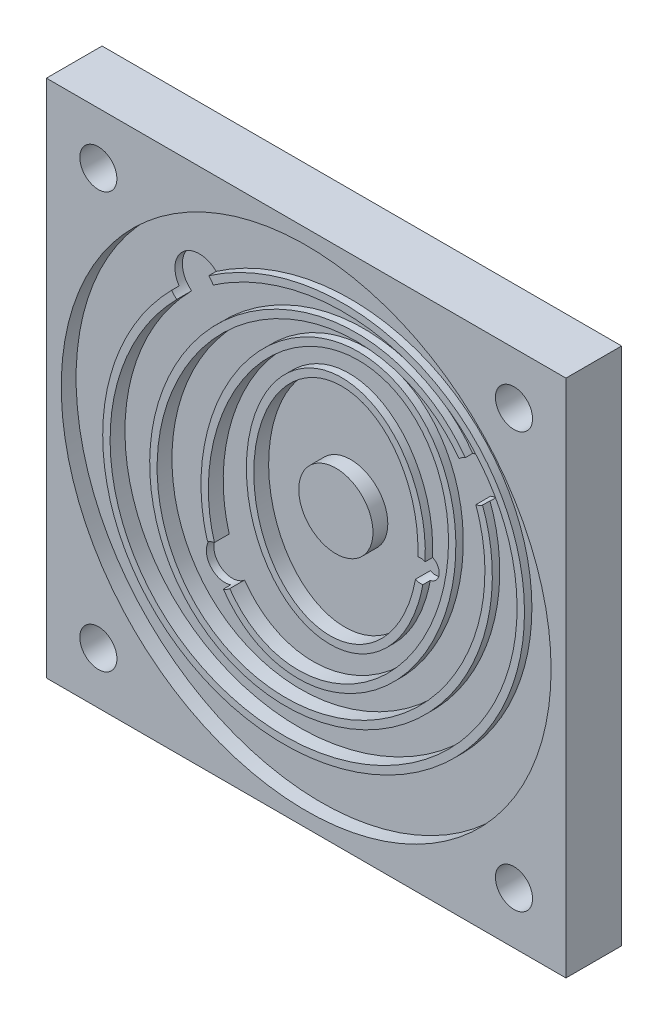
ISO-10303-21;
HEADER;
FILE_DESCRIPTION(('STEP AP214'),'2;1');
FILE_NAME('part.step','',(''),(''),'','','');
FILE_SCHEMA(('AUTOMOTIVE_DESIGN { 1 0 10303 214 1 1 1 1 }'));
ENDSEC;
DATA;
#1=APPLICATION_CONTEXT('core data for automotive mechanical design processes');
#2=APPLICATION_PROTOCOL_DEFINITION('international standard','automotive_design',2000,#1);
#3=PRODUCT_CONTEXT('',#1,'mechanical');
#4=PRODUCT('Part','Part','',(#3));
#5=PRODUCT_RELATED_PRODUCT_CATEGORY('part','',(#4));
#6=PRODUCT_DEFINITION_FORMATION('','',#4);
#7=PRODUCT_DEFINITION_CONTEXT('part definition',#1,'design');
#8=PRODUCT_DEFINITION('design','',#6,#7);
#9=PRODUCT_DEFINITION_SHAPE('','',#8);
#10=(LENGTH_UNIT() NAMED_UNIT(*) SI_UNIT(.MILLI.,.METRE.));
#11=(NAMED_UNIT(*) PLANE_ANGLE_UNIT() SI_UNIT($,.RADIAN.));
#12=(NAMED_UNIT(*) SI_UNIT($,.STERADIAN.) SOLID_ANGLE_UNIT());
#13=UNCERTAINTY_MEASURE_WITH_UNIT(LENGTH_MEASURE(1.E-05),#10,'distance_accuracy_value','');
#14=(GEOMETRIC_REPRESENTATION_CONTEXT(3) GLOBAL_UNCERTAINTY_ASSIGNED_CONTEXT((#13)) GLOBAL_UNIT_ASSIGNED_CONTEXT((#10,
#11,#12)) REPRESENTATION_CONTEXT('',''));
#15=CARTESIAN_POINT('',(0.,0.,0.));
#16=DIRECTION('',(0.,0.,1.));
#17=DIRECTION('',(1.,0.,0.));
#18=AXIS2_PLACEMENT_3D('',#15,#16,#17);
#19=CARTESIAN_POINT('',(0.,0.,2.54));
#20=DIRECTION('',(0.,0.,1.));
#21=DIRECTION('',(-0.11130266352812,-0.993786555096992,0.));
#22=AXIS2_PLACEMENT_3D('',#19,#20,#21);
#23=ELLIPSE('',#22,20.32,15.24);
#24=DIRECTION('',(0.,0.,1.));
#25=VECTOR('',#24,1.);
#26=SURFACE_OF_LINEAR_EXTRUSION('',#23,#25);
#27=DIRECTION('',(0.,0.,1.));
#28=VECTOR('',#27,1.);
#29=CARTESIAN_POINT('',(14.8837053667459,-3.48793318147961,2.54));
#30=LINE('',#29,#28);
#31=CARTESIAN_POINT('',(14.8837053667459,-3.48793318147961,2.54));
#32=VERTEX_POINT('',#31);
#33=CARTESIAN_POINT('',(14.8837053667459,-3.48793318147961,3.81));
#34=VERTEX_POINT('',#33);
#35=EDGE_CURVE('E201',#32,#34,#30,.T.);
#36=ORIENTED_EDGE('',*,*,#35,.T.);
#37=CARTESIAN_POINT('',(0.,0.,3.81));
#38=DIRECTION('',(0.,0.,1.));
#39=DIRECTION('',(-0.11130266352812,-0.993786555096992,0.));
#40=AXIS2_PLACEMENT_3D('',#37,#38,#39);
#41=ELLIPSE('',#40,20.32,15.24);
#42=CARTESIAN_POINT('',(15.2865464471401,0.108908411042989,3.81));
#43=VERTEX_POINT('',#42);
#44=EDGE_CURVE('E189',#34,#43,#41,.F.);
#45=ORIENTED_EDGE('',*,*,#44,.T.);
#46=DIRECTION('',(0.,0.,1.));
#47=VECTOR('',#46,1.);
#48=CARTESIAN_POINT('',(15.2865464471401,0.108908411042989,2.54));
#49=LINE('',#48,#47);
#50=CARTESIAN_POINT('',(15.2865464471401,0.108908411042988,2.54));
#51=VERTEX_POINT('',#50);
#52=EDGE_CURVE('E200',#51,#43,#49,.T.);
#53=ORIENTED_EDGE('',*,*,#52,.F.);
#54=EDGE_CURVE('E229',#51,#32,#23,.T.);
#55=ORIENTED_EDGE('',*,*,#54,.T.);
#56=EDGE_LOOP('',(#36,#45,#53,#55));
#57=FACE_BOUND('',#56,.T.);
#58=ADVANCED_FACE('F53',(#57),#26,.T.);
#59=CARTESIAN_POINT('',(0.,0.,1.27));
#60=DIRECTION('',(0.,0.,1.));
#61=DIRECTION('',(-0.11130266352812,-0.993786555096992,0.));
#62=AXIS2_PLACEMENT_3D('',#59,#60,#61);
#63=ELLIPSE('',#62,19.05,13.97);
#64=DIRECTION('',(0.,0.,1.));
#65=VECTOR('',#64,1.);
#66=SURFACE_OF_LINEAR_EXTRUSION('',#63,#65);
#67=CARTESIAN_POINT('',(0.,0.,3.81));
#68=DIRECTION('',(0.,0.,1.));
#69=DIRECTION('',(-0.11130266352812,-0.993786555096992,0.));
#70=AXIS2_PLACEMENT_3D('',#67,#68,#69);
#71=ELLIPSE('',#70,19.05,13.97);
#72=CARTESIAN_POINT('',(13.6267115839412,-3.30400999929288,3.81));
#73=VERTEX_POINT('',#72);
#74=CARTESIAN_POINT('',(14.0200087660044,0.207617119973123,3.81));
#75=VERTEX_POINT('',#74);
#76=EDGE_CURVE('E67',#73,#75,#71,.F.);
#77=ORIENTED_EDGE('',*,*,#76,.F.);
#78=DIRECTION('',(0.,0.,1.));
#79=VECTOR('',#78,1.);
#80=CARTESIAN_POINT('',(13.6267115839412,-3.30400999929288,1.27));
#81=LINE('',#80,#79);
#82=CARTESIAN_POINT('',(13.6267115839412,-3.30400999929288,1.27));
#83=VERTEX_POINT('',#82);
#84=EDGE_CURVE('E230',#83,#73,#81,.T.);
#85=ORIENTED_EDGE('',*,*,#84,.F.);
#86=CARTESIAN_POINT('',(14.0200087660044,0.207617119973123,1.27));
#87=VERTEX_POINT('',#86);
#88=EDGE_CURVE('E231',#87,#83,#63,.T.);
#89=ORIENTED_EDGE('',*,*,#88,.F.);
#90=DIRECTION('',(0.,0.,1.));
#91=VECTOR('',#90,1.);
#92=CARTESIAN_POINT('',(14.0200087660044,0.207617119973123,1.27));
#93=LINE('',#92,#91);
#94=EDGE_CURVE('E226',#87,#75,#93,.T.);
#95=ORIENTED_EDGE('',*,*,#94,.T.);
#96=EDGE_LOOP('',(#77,#85,#89,#95));
#97=FACE_BOUND('',#96,.T.);
#98=ADVANCED_FACE('F402',(#97),#66,.F.);
#99=CARTESIAN_POINT('',(0.,0.,1.27));
#100=DIRECTION('',(0.,0.,1.));
#101=DIRECTION('',(1.,0.,0.));
#102=AXIS2_PLACEMENT_3D('',#99,#100,#101);
#103=CYLINDRICAL_SURFACE('',#102,6.35);
#104=CARTESIAN_POINT('',(0.,0.,1.27));
#105=DIRECTION('',(0.,0.,1.));
#106=DIRECTION('',(1.,0.,0.));
#107=AXIS2_PLACEMENT_3D('',#104,#105,#106);
#108=CIRCLE('',#107,6.35);
#109=CARTESIAN_POINT('',(6.35,0.,1.27));
#110=VERTEX_POINT('',#109);
#111=EDGE_CURVE('E347',#110,#110,#108,.T.);
#112=CARTESIAN_POINT('',(0.,0.,3.81));
#113=DIRECTION('',(0.,0.,1.));
#114=DIRECTION('',(1.,0.,0.));
#115=AXIS2_PLACEMENT_3D('',#112,#113,#114);
#116=CIRCLE('',#115,6.35);
#117=CARTESIAN_POINT('',(6.35,0.,3.81));
#118=VERTEX_POINT('',#117);
#119=EDGE_CURVE('E386',#118,#118,#116,.F.);
#120=CARTESIAN_POINT('',(6.35,0.,1.27));
#121=CARTESIAN_POINT('',(6.35,0.,1.29645833333333));
#122=CARTESIAN_POINT('',(6.35,0.,1.32291666666667));
#123=CARTESIAN_POINT('',(6.35,0.,1.37583333333333));
#124=CARTESIAN_POINT('',(6.35,0.,1.40229166666667));
#125=CARTESIAN_POINT('',(6.35,0.,1.45520833333333));
#126=CARTESIAN_POINT('',(6.35,0.,1.48166666666667));
#127=CARTESIAN_POINT('',(6.35,0.,1.53458333333333));
#128=CARTESIAN_POINT('',(6.35,0.,1.56104166666667));
#129=CARTESIAN_POINT('',(6.35,0.,1.61395833333333));
#130=CARTESIAN_POINT('',(6.35,0.,1.64041666666667));
#131=CARTESIAN_POINT('',(6.35,0.,1.69333333333333));
#132=CARTESIAN_POINT('',(6.35,0.,1.71979166666667));
#133=CARTESIAN_POINT('',(6.35,0.,1.77270833333333));
#134=CARTESIAN_POINT('',(6.35,0.,1.79916666666667));
#135=CARTESIAN_POINT('',(6.35,0.,1.85208333333333));
#136=CARTESIAN_POINT('',(6.35,0.,1.87854166666667));
#137=CARTESIAN_POINT('',(6.35,0.,1.93145833333333));
#138=CARTESIAN_POINT('',(6.35,0.,1.95791666666667));
#139=CARTESIAN_POINT('',(6.35,0.,2.01083333333333));
#140=CARTESIAN_POINT('',(6.35,0.,2.03729166666667));
#141=CARTESIAN_POINT('',(6.35,0.,2.09020833333333));
#142=CARTESIAN_POINT('',(6.35,0.,2.11666666666667));
#143=CARTESIAN_POINT('',(6.35,0.,2.16958333333333));
#144=CARTESIAN_POINT('',(6.35,0.,2.19604166666667));
#145=CARTESIAN_POINT('',(6.35,0.,2.24895833333333));
#146=CARTESIAN_POINT('',(6.35,0.,2.27541666666667));
#147=CARTESIAN_POINT('',(6.35,0.,2.32833333333333));
#148=CARTESIAN_POINT('',(6.35,0.,2.35479166666667));
#149=CARTESIAN_POINT('',(6.35,0.,2.40770833333333));
#150=CARTESIAN_POINT('',(6.35,0.,2.43416666666667));
#151=CARTESIAN_POINT('',(6.35,0.,2.48708333333333));
#152=CARTESIAN_POINT('',(6.35,0.,2.51354166666667));
#153=CARTESIAN_POINT('',(6.35,0.,2.56645833333333));
#154=CARTESIAN_POINT('',(6.35,0.,2.59291666666667));
#155=CARTESIAN_POINT('',(6.35,0.,2.64583333333333));
#156=CARTESIAN_POINT('',(6.35,0.,2.67229166666667));
#157=CARTESIAN_POINT('',(6.35,0.,2.72520833333333));
#158=CARTESIAN_POINT('',(6.35,0.,2.75166666666667));
#159=CARTESIAN_POINT('',(6.35,0.,2.80458333333333));
#160=CARTESIAN_POINT('',(6.35,0.,2.83104166666667));
#161=CARTESIAN_POINT('',(6.35,0.,2.88395833333333));
#162=CARTESIAN_POINT('',(6.35,0.,2.91041666666667));
#163=CARTESIAN_POINT('',(6.35,0.,2.96333333333333));
#164=CARTESIAN_POINT('',(6.35,0.,2.98979166666667));
#165=CARTESIAN_POINT('',(6.35,0.,3.04270833333333));
#166=CARTESIAN_POINT('',(6.35,0.,3.06916666666667));
#167=CARTESIAN_POINT('',(6.35,0.,3.12208333333333));
#168=CARTESIAN_POINT('',(6.35,0.,3.14854166666667));
#169=CARTESIAN_POINT('',(6.35,0.,3.20145833333333));
#170=CARTESIAN_POINT('',(6.35,0.,3.22791666666667));
#171=CARTESIAN_POINT('',(6.35,0.,3.28083333333333));
#172=CARTESIAN_POINT('',(6.35,0.,3.30729166666667));
#173=CARTESIAN_POINT('',(6.35,0.,3.36020833333333));
#174=CARTESIAN_POINT('',(6.35,0.,3.38666666666667));
#175=CARTESIAN_POINT('',(6.35,0.,3.43958333333333));
#176=CARTESIAN_POINT('',(6.35,0.,3.46604166666667));
#177=CARTESIAN_POINT('',(6.35,0.,3.51895833333333));
#178=CARTESIAN_POINT('',(6.35,0.,3.54541666666667));
#179=CARTESIAN_POINT('',(6.35,0.,3.59833333333333));
#180=CARTESIAN_POINT('',(6.35,0.,3.62479166666667));
#181=CARTESIAN_POINT('',(6.35,0.,3.67770833333333));
#182=CARTESIAN_POINT('',(6.35,0.,3.70416666666667));
#183=CARTESIAN_POINT('',(6.35,0.,3.75708333333333));
#184=CARTESIAN_POINT('',(6.35,0.,3.78354166666667));
#185=CARTESIAN_POINT('',(6.35,0.,3.81));
#186=B_SPLINE_CURVE_WITH_KNOTS('',3,(#120,#121,#122,#123,#124,#125,#126,#127,#128,#129,#130,
#131,#132,#133,#134,#135,#136,#137,#138,#139,#140,#141,#142,#143,#144,#145,#146,#147,#148,#149,
#150,#151,#152,#153,#154,#155,#156,#157,#158,#159,#160,#161,#162,#163,#164,#165,#166,#167,#168,
#169,#170,#171,#172,#173,#174,#175,#176,#177,#178,#179,#180,#181,#182,#183,#184,#185),
.UNSPECIFIED.,.F.,.F.,(4,2,2,2,2,2,2,2,2,2,2,2,2,2,2,2,2,2,2,2,2,2,2,2,2,2,2,2,2,2,2,2,4),(0.,
0.079375,0.15875,0.238125,0.3175,0.396875,0.47625,0.555625,0.635,0.714375,0.79375,0.873125,
0.9525,1.031875,1.11125,1.190625,1.27,1.349375,1.42875,1.508125,1.5875,1.666875,1.74625,
1.825625,1.905,1.984375,2.06375,2.143125,2.2225,2.301875,2.38125,2.460625,2.54),.UNSPECIFIED.);
#187=EDGE_CURVE('BSEAM391',#110,#118,#186,.T.);
#188=ORIENTED_EDGE('',*,*,#111,.T.);
#189=ORIENTED_EDGE('',*,*,#119,.T.);
#190=ORIENTED_EDGE('',*,*,#187,.T.);
#191=ORIENTED_EDGE('',*,*,#187,.F.);
#192=EDGE_LOOP('',(#188,#190,#189,#191));
#193=FACE_BOUND('',#192,.T.);
#194=ADVANCED_FACE('F391',(#193),#103,.T.);
#195=CARTESIAN_POINT('',(14.5142526371916,-1.6255754008282,-4.10019316042019));
#196=DIRECTION('',(0.,0.,1.));
#197=DIRECTION('',(1.,0.,0.));
#198=AXIS2_PLACEMENT_3D('',#195,#196,#197);
#199=CYLINDRICAL_SURFACE('',#198,1.89865000000737);
#200=CARTESIAN_POINT('',(14.5142526371916,-1.6255754008282,3.81));
#201=DIRECTION('',(0.,0.,1.));
#202=DIRECTION('',(1.,0.,0.));
#203=AXIS2_PLACEMENT_3D('',#200,#201,#202);
#204=CIRCLE('',#203,1.89865000000737);
#205=EDGE_CURVE('E14',#34,#73,#204,.F.);
#206=ORIENTED_EDGE('',*,*,#205,.F.);
#207=ORIENTED_EDGE('',*,*,#35,.F.);
#208=CARTESIAN_POINT('',(14.5142526371916,-1.6255754008282,2.54));
#209=DIRECTION('',(0.,0.,1.));
#210=DIRECTION('',(1.,0.,0.));
#211=AXIS2_PLACEMENT_3D('',#208,#209,#210);
#212=CIRCLE('',#211,1.89865000000737);
#213=EDGE_CURVE('E205',#32,#51,#212,.T.);
#214=ORIENTED_EDGE('',*,*,#213,.T.);
#215=ORIENTED_EDGE('',*,*,#52,.T.);
#216=EDGE_CURVE('E57',#75,#43,#204,.F.);
#217=ORIENTED_EDGE('',*,*,#216,.F.);
#218=ORIENTED_EDGE('',*,*,#94,.F.);
#219=CARTESIAN_POINT('',(14.5142526371916,-1.6255754008282,1.27));
#220=DIRECTION('',(0.,0.,1.));
#221=DIRECTION('',(1.,0.,0.));
#222=AXIS2_PLACEMENT_3D('',#219,#220,#221);
#223=CIRCLE('',#222,1.89865000000737);
#224=EDGE_CURVE('E361',#87,#83,#223,.F.);
#225=ORIENTED_EDGE('',*,*,#224,.T.);
#226=ORIENTED_EDGE('',*,*,#84,.T.);
#227=EDGE_LOOP('',(#206,#207,#214,#215,#217,#218,#225,#226));
#228=FACE_BOUND('',#227,.T.);
#229=ADVANCED_FACE('F203',(#228),#199,.F.);
#230=CARTESIAN_POINT('',(0.,0.,3.81));
#231=DIRECTION('',(0.,0.,1.));
#232=DIRECTION('',(-0.412606619519122,-0.91090931355926,0.));
#233=AXIS2_PLACEMENT_3D('',#230,#231,#232);
#234=ELLIPSE('',#233,27.94,20.32);
#235=DIRECTION('',(0.,0.,1.));
#236=VECTOR('',#235,1.);
#237=SURFACE_OF_LINEAR_EXTRUSION('',#234,#236);
#238=DIRECTION('',(0.,0.,1.));
#239=VECTOR('',#238,1.);
#240=CARTESIAN_POINT('',(-20.6851530126943,-14.2528175336064,3.81));
#241=LINE('',#240,#239);
#242=CARTESIAN_POINT('',(-20.6851530126943,-14.2528175336063,3.81));
#243=VERTEX_POINT('',#242);
#244=CARTESIAN_POINT('',(-20.6851530126943,-14.2528175336064,5.08));
#245=VERTEX_POINT('',#244);
#246=EDGE_CURVE('E451',#243,#245,#241,.T.);
#247=ORIENTED_EDGE('',*,*,#246,.T.);
#248=CARTESIAN_POINT('',(0.,0.,5.08));
#249=DIRECTION('',(0.,0.,1.));
#250=DIRECTION('',(-0.412606619519122,-0.91090931355926,0.));
#251=AXIS2_PLACEMENT_3D('',#248,#249,#250);
#252=ELLIPSE('',#251,27.94,20.32);
#253=CARTESIAN_POINT('',(-17.9858860248078,-19.9488880210165,5.08));
#254=VERTEX_POINT('',#253);
#255=EDGE_CURVE('E75',#245,#254,#252,.F.);
#256=ORIENTED_EDGE('',*,*,#255,.T.);
#257=DIRECTION('',(0.,0.,1.));
#258=VECTOR('',#257,1.);
#259=CARTESIAN_POINT('',(-17.9858860248078,-19.9488880210165,3.81));
#260=LINE('',#259,#258);
#261=CARTESIAN_POINT('',(-17.9858860248078,-19.9488880210165,3.81));
#262=VERTEX_POINT('',#261);
#263=EDGE_CURVE('E450',#262,#254,#260,.T.);
#264=ORIENTED_EDGE('',*,*,#263,.F.);
#265=EDGE_CURVE('E267',#262,#243,#234,.T.);
#266=ORIENTED_EDGE('',*,*,#265,.T.);
#267=EDGE_LOOP('',(#247,#256,#264,#266));
#268=FACE_BOUND('',#267,.T.);
#269=ADVANCED_FACE('F277',(#268),#237,.T.);
#270=CARTESIAN_POINT('',(0.,0.,2.54));
#271=DIRECTION('',(0.,0.,1.));
#272=DIRECTION('',(-0.412606619519121,-0.91090931355926,0.));
#273=AXIS2_PLACEMENT_3D('',#270,#271,#272);
#274=ELLIPSE('',#273,26.67,19.05);
#275=DIRECTION('',(0.,0.,1.));
#276=VECTOR('',#275,1.);
#277=SURFACE_OF_LINEAR_EXTRUSION('',#274,#276);
#278=CARTESIAN_POINT('',(0.,0.,5.08));
#279=DIRECTION('',(0.,0.,1.));
#280=DIRECTION('',(-0.412606619519121,-0.91090931355926,0.));
#281=AXIS2_PLACEMENT_3D('',#278,#279,#280);
#282=ELLIPSE('',#281,26.67,19.05);
#283=CARTESIAN_POINT('',(-19.5114163050823,-13.804639754895,5.08));
#284=VERTEX_POINT('',#283);
#285=CARTESIAN_POINT('',(-16.8902141551804,-19.3193890532274,5.08));
#286=VERTEX_POINT('',#285);
#287=EDGE_CURVE('E381',#284,#286,#282,.F.);
#288=ORIENTED_EDGE('',*,*,#287,.F.);
#289=DIRECTION('',(0.,0.,1.));
#290=VECTOR('',#289,1.);
#291=CARTESIAN_POINT('',(-19.5114163050825,-13.8046397548937,2.54));
#292=LINE('',#291,#290);
#293=CARTESIAN_POINT('',(-19.5114163050823,-13.804639754895,2.54));
#294=VERTEX_POINT('',#293);
#295=EDGE_CURVE('E210',#294,#284,#292,.T.);
#296=ORIENTED_EDGE('',*,*,#295,.F.);
#297=CARTESIAN_POINT('',(-16.8902141551806,-19.3193890532274,2.54));
#298=VERTEX_POINT('',#297);
#299=EDGE_CURVE('E207',#298,#294,#274,.T.);
#300=ORIENTED_EDGE('',*,*,#299,.F.);
#301=DIRECTION('',(0.,0.,1.));
#302=VECTOR('',#301,1.);
#303=CARTESIAN_POINT('',(-16.8902141551806,-19.3193890532274,2.54));
#304=LINE('',#303,#302);
#305=EDGE_CURVE('E252',#298,#286,#304,.T.);
#306=ORIENTED_EDGE('',*,*,#305,.T.);
#307=EDGE_LOOP('',(#288,#296,#300,#306));
#308=FACE_BOUND('',#307,.T.);
#309=ADVANCED_FACE('F258',(#308),#277,.F.);
#310=CARTESIAN_POINT('',(-18.9880948747053,-16.936214387649,-6.44025612106931));
#311=DIRECTION('',(0.,0.,1.));
#312=DIRECTION('',(1.,0.,0.));
#313=AXIS2_PLACEMENT_3D('',#310,#311,#312);
#314=CYLINDRICAL_SURFACE('',#313,3.17500000000006);
#315=CARTESIAN_POINT('',(-18.9880948747053,-16.936214387649,5.08));
#316=DIRECTION('',(0.,0.,1.));
#317=DIRECTION('',(1.,0.,0.));
#318=AXIS2_PLACEMENT_3D('',#315,#316,#317);
#319=CIRCLE('',#318,3.17500000000006);
#320=EDGE_CURVE('E380',#286,#254,#319,.F.);
#321=ORIENTED_EDGE('',*,*,#320,.F.);
#322=ORIENTED_EDGE('',*,*,#305,.F.);
#323=CARTESIAN_POINT('',(-18.9880948747053,-16.936214387649,2.54));
#324=DIRECTION('',(0.,0.,1.));
#325=DIRECTION('',(1.,0.,0.));
#326=AXIS2_PLACEMENT_3D('',#323,#324,#325);
#327=CIRCLE('',#326,3.17500000000006);
#328=EDGE_CURVE('E358',#298,#294,#327,.F.);
#329=ORIENTED_EDGE('',*,*,#328,.T.);
#330=ORIENTED_EDGE('',*,*,#295,.T.);
#331=EDGE_CURVE('E383',#245,#284,#319,.F.);
#332=ORIENTED_EDGE('',*,*,#331,.F.);
#333=ORIENTED_EDGE('',*,*,#246,.F.);
#334=CARTESIAN_POINT('',(-18.9880948747053,-16.936214387649,3.81));
#335=DIRECTION('',(0.,0.,1.));
#336=DIRECTION('',(1.,0.,0.));
#337=AXIS2_PLACEMENT_3D('',#334,#335,#336);
#338=CIRCLE('',#337,3.17500000000005);
#339=EDGE_CURVE('E271',#243,#262,#338,.T.);
#340=ORIENTED_EDGE('',*,*,#339,.T.);
#341=ORIENTED_EDGE('',*,*,#263,.T.);
#342=EDGE_LOOP('',(#321,#322,#329,#330,#332,#333,#340,#341));
#343=FACE_BOUND('',#342,.T.);
#344=ADVANCED_FACE('F426',(#343),#314,.F.);
#345=CARTESIAN_POINT('',(0.,0.,5.08));
#346=DIRECTION('',(0.,0.,1.));
#347=DIRECTION('',(0.625223547858391,0.780445715731316,0.));
#348=AXIS2_PLACEMENT_3D('',#345,#346,#347);
#349=ELLIPSE('',#348,33.02,26.67);
#350=DIRECTION('',(0.,0.,1.));
#351=VECTOR('',#350,1.);
#352=SURFACE_OF_LINEAR_EXTRUSION('',#349,#351);
#353=DIRECTION('',(0.,0.,1.));
#354=VECTOR('',#353,1.);
#355=CARTESIAN_POINT('',(27.6439483915943,15.9498945313286,5.08));
#356=LINE('',#355,#354);
#357=CARTESIAN_POINT('',(27.6439483915939,15.9498945313291,5.08));
#358=VERTEX_POINT('',#357);
#359=CARTESIAN_POINT('',(27.6439483915943,15.9498945313286,6.35));
#360=VERTEX_POINT('',#359);
#361=EDGE_CURVE('E291',#358,#360,#356,.T.);
#362=ORIENTED_EDGE('',*,*,#361,.T.);
#363=CARTESIAN_POINT('',(0.,0.,6.34999999999999));
#364=DIRECTION('',(0.,0.,1.));
#365=DIRECTION('',(-0.625223547858387,-0.78044571573132,0.));
#366=AXIS2_PLACEMENT_3D('',#363,#364,#365);
#367=ELLIPSE('',#366,33.02,26.67);
#368=CARTESIAN_POINT('',(24.6916632069377,21.5074471577898,6.35));
#369=VERTEX_POINT('',#368);
#370=EDGE_CURVE('E377',#360,#369,#367,.F.);
#371=ORIENTED_EDGE('',*,*,#370,.T.);
#372=DIRECTION('',(0.,0.,1.));
#373=VECTOR('',#372,1.);
#374=CARTESIAN_POINT('',(24.6916632069377,21.5074471577898,5.08));
#375=LINE('',#374,#373);
#376=CARTESIAN_POINT('',(24.6916632069381,21.5074471577894,5.08));
#377=VERTEX_POINT('',#376);
#378=EDGE_CURVE('E290',#377,#369,#375,.T.);
#379=ORIENTED_EDGE('',*,*,#378,.F.);
#380=EDGE_CURVE('E932',#377,#358,#349,.T.);
#381=ORIENTED_EDGE('',*,*,#380,.T.);
#382=EDGE_LOOP('',(#362,#371,#379,#381));
#383=FACE_BOUND('',#382,.T.);
#384=ADVANCED_FACE('F429',(#383),#352,.T.);
#385=CARTESIAN_POINT('',(0.,0.,3.81));
#386=DIRECTION('',(0.,0.,1.));
#387=DIRECTION('',(-0.624138973071549,-0.781313344499627,0.));
#388=AXIS2_PLACEMENT_3D('',#385,#386,#387);
#389=ELLIPSE('',#388,31.75,25.4);
#390=DIRECTION('',(0.,0.,1.));
#391=VECTOR('',#390,1.);
#392=SURFACE_OF_LINEAR_EXTRUSION('',#389,#391);
#393=CARTESIAN_POINT('',(0.,0.,6.35));
#394=DIRECTION('',(0.,0.,1.));
#395=DIRECTION('',(-0.624138973071549,-0.781313344499627,0.));
#396=AXIS2_PLACEMENT_3D('',#393,#394,#395);
#397=ELLIPSE('',#396,31.75,25.4);
#398=CARTESIAN_POINT('',(26.4800075677458,15.429814379142,6.35));
#399=VERTEX_POINT('',#398);
#400=CARTESIAN_POINT('',(23.6085178969699,20.8335801607612,6.35));
#401=VERTEX_POINT('',#400);
#402=EDGE_CURVE('E373',#399,#401,#397,.F.);
#403=ORIENTED_EDGE('',*,*,#402,.F.);
#404=DIRECTION('',(0.,0.,1.));
#405=VECTOR('',#404,1.);
#406=CARTESIAN_POINT('',(26.4800075677458,15.429814379142,3.81));
#407=LINE('',#406,#405);
#408=CARTESIAN_POINT('',(26.4800075677458,15.429814379142,3.81));
#409=VERTEX_POINT('',#408);
#410=EDGE_CURVE('E456',#409,#399,#407,.T.);
#411=ORIENTED_EDGE('',*,*,#410,.F.);
#412=CARTESIAN_POINT('',(23.6085178969699,20.8335801607612,3.81));
#413=VERTEX_POINT('',#412);
#414=EDGE_CURVE('E454',#413,#409,#389,.T.);
#415=ORIENTED_EDGE('',*,*,#414,.F.);
#416=DIRECTION('',(0.,0.,1.));
#417=VECTOR('',#416,1.);
#418=CARTESIAN_POINT('',(23.6085178969699,20.8335801607612,3.81));
#419=LINE('',#418,#417);
#420=EDGE_CURVE('E927',#413,#401,#419,.T.);
#421=ORIENTED_EDGE('',*,*,#420,.T.);
#422=EDGE_LOOP('',(#403,#411,#415,#421));
#423=FACE_BOUND('',#422,.T.);
#424=ADVANCED_FACE('F424',(#423),#392,.F.);
#425=CARTESIAN_POINT('',(25.7930954518684,18.5296170736795,-5.1702561210697));
#426=DIRECTION('',(0.,0.,1.));
#427=DIRECTION('',(1.,0.,0.));
#428=AXIS2_PLACEMENT_3D('',#425,#426,#427);
#429=CYLINDRICAL_SURFACE('',#428,3.17500000000019);
#430=CARTESIAN_POINT('',(25.7930954518684,18.5296170736795,6.35));
#431=DIRECTION('',(0.,0.,1.));
#432=DIRECTION('',(1.,0.,0.));
#433=AXIS2_PLACEMENT_3D('',#430,#431,#432);
#434=CIRCLE('',#433,3.17500000000019);
#435=EDGE_CURVE('E372',#360,#399,#434,.F.);
#436=ORIENTED_EDGE('',*,*,#435,.F.);
#437=ORIENTED_EDGE('',*,*,#361,.F.);
#438=CARTESIAN_POINT('',(25.7930954518684,18.5296170736795,5.08));
#439=DIRECTION('',(0.,0.,1.));
#440=DIRECTION('',(1.,0.,0.));
#441=AXIS2_PLACEMENT_3D('',#438,#439,#440);
#442=CIRCLE('',#441,3.17500000000086);
#443=EDGE_CURVE('E940',#358,#377,#442,.T.);
#444=ORIENTED_EDGE('',*,*,#443,.T.);
#445=ORIENTED_EDGE('',*,*,#378,.T.);
#446=EDGE_CURVE('E375',#401,#369,#434,.F.);
#447=ORIENTED_EDGE('',*,*,#446,.F.);
#448=ORIENTED_EDGE('',*,*,#420,.F.);
#449=CARTESIAN_POINT('',(25.7930954518684,18.5296170736795,3.81));
#450=DIRECTION('',(0.,0.,1.));
#451=DIRECTION('',(1.,0.,0.));
#452=AXIS2_PLACEMENT_3D('',#449,#450,#451);
#453=CIRCLE('',#452,3.17500000000019);
#454=EDGE_CURVE('E355',#413,#409,#453,.F.);
#455=ORIENTED_EDGE('',*,*,#454,.T.);
#456=ORIENTED_EDGE('',*,*,#410,.T.);
#457=EDGE_LOOP('',(#436,#437,#444,#445,#447,#448,#455,#456));
#458=FACE_BOUND('',#457,.T.);
#459=ADVANCED_FACE('F311',(#458),#429,.F.);
#460=CARTESIAN_POINT('',(0.,0.,6.35));
#461=DIRECTION('',(0.,0.,1.));
#462=DIRECTION('',(-0.765710240659507,-0.643185686523854,0.));
#463=AXIS2_PLACEMENT_3D('',#460,#461,#462);
#464=ELLIPSE('',#463,38.1,33.02);
#465=DIRECTION('',(0.,0.,1.));
#466=VECTOR('',#465,1.);
#467=SURFACE_OF_LINEAR_EXTRUSION('',#464,#466);
#468=DIRECTION('',(0.,0.,1.));
#469=VECTOR('',#468,1.);
#470=CARTESIAN_POINT('',(-17.9345173510263,27.8021313635714,6.35));
#471=LINE('',#470,#469);
#472=CARTESIAN_POINT('',(-17.9345173510263,27.8021313635714,6.35));
#473=VERTEX_POINT('',#472);
#474=CARTESIAN_POINT('',(-17.9345173510263,27.8021313635714,7.62));
#475=VERTEX_POINT('',#474);
#476=EDGE_CURVE('E470',#473,#475,#471,.T.);
#477=ORIENTED_EDGE('',*,*,#476,.T.);
#478=CARTESIAN_POINT('',(0.,0.,7.61999999999997));
#479=DIRECTION('',(0.,0.,1.));
#480=DIRECTION('',(-0.765710240659507,-0.643185686523854,0.));
#481=AXIS2_PLACEMENT_3D('',#478,#479,#480);
#482=ELLIPSE('',#481,38.1,33.02);
#483=CARTESIAN_POINT('',(-24.2814433440837,22.4721010513753,7.62));
#484=VERTEX_POINT('',#483);
#485=EDGE_CURVE('E369',#475,#484,#482,.F.);
#486=ORIENTED_EDGE('',*,*,#485,.T.);
#487=DIRECTION('',(0.,0.,1.));
#488=VECTOR('',#487,1.);
#489=CARTESIAN_POINT('',(-24.2814433440837,22.4721010513753,6.35));
#490=LINE('',#489,#488);
#491=CARTESIAN_POINT('',(-24.2814433440837,22.4721010513753,6.35));
#492=VERTEX_POINT('',#491);
#493=EDGE_CURVE('E334',#492,#484,#490,.T.);
#494=ORIENTED_EDGE('',*,*,#493,.F.);
#495=EDGE_CURVE('E315',#492,#473,#464,.T.);
#496=ORIENTED_EDGE('',*,*,#495,.T.);
#497=EDGE_LOOP('',(#477,#486,#494,#496));
#498=FACE_BOUND('',#497,.T.);
#499=ADVANCED_FACE('F304',(#498),#467,.T.);
#500=CARTESIAN_POINT('',(0.,0.,5.08));
#501=DIRECTION('',(0.,0.,1.));
#502=DIRECTION('',(-0.765710240659507,-0.643185686523853,0.));
#503=AXIS2_PLACEMENT_3D('',#500,#501,#502);
#504=ELLIPSE('',#503,36.83,31.75);
#505=DIRECTION('',(0.,0.,1.));
#506=VECTOR('',#505,1.);
#507=SURFACE_OF_LINEAR_EXTRUSION('',#504,#506);
#508=CARTESIAN_POINT('',(0.,0.,7.62));
#509=DIRECTION('',(0.,0.,1.));
#510=DIRECTION('',(-0.765710240659507,-0.643185686523853,0.));
#511=AXIS2_PLACEMENT_3D('',#508,#509,#510);
#512=ELLIPSE('',#511,36.83,31.75);
#513=CARTESIAN_POINT('',(-17.1641672379157,26.7908100181848,7.62));
#514=VERTEX_POINT('',#513);
#515=CARTESIAN_POINT('',(-23.4185086067691,21.5385297081763,7.62));
#516=VERTEX_POINT('',#515);
#517=EDGE_CURVE('E365',#514,#516,#512,.F.);
#518=ORIENTED_EDGE('',*,*,#517,.F.);
#519=DIRECTION('',(0.,0.,1.));
#520=VECTOR('',#519,1.);
#521=CARTESIAN_POINT('',(-17.1641672379157,26.7908100181848,5.08));
#522=LINE('',#521,#520);
#523=CARTESIAN_POINT('',(-17.1641672379157,26.7908100181848,5.08));
#524=VERTEX_POINT('',#523);
#525=EDGE_CURVE('E289',#524,#514,#522,.T.);
#526=ORIENTED_EDGE('',*,*,#525,.F.);
#527=CARTESIAN_POINT('',(-23.4185086067691,21.5385297081763,5.08));
#528=VERTEX_POINT('',#527);
#529=EDGE_CURVE('E284',#528,#524,#504,.T.);
#530=ORIENTED_EDGE('',*,*,#529,.F.);
#531=DIRECTION('',(0.,0.,1.));
#532=VECTOR('',#531,1.);
#533=CARTESIAN_POINT('',(-23.4185086067691,21.5385297081763,5.08));
#534=LINE('',#533,#532);
#535=EDGE_CURVE('E294',#528,#516,#534,.T.);
#536=ORIENTED_EDGE('',*,*,#535,.T.);
#537=EDGE_LOOP('',(#518,#526,#530,#536));
#538=FACE_BOUND('',#537,.T.);
#539=ADVANCED_FACE('F299',(#538),#507,.F.);
#540=CARTESIAN_POINT('',(-20.8255985990377,24.800859947255,-6.7067657640257));
#541=DIRECTION('',(0.,0.,1.));
#542=DIRECTION('',(1.,0.,0.));
#543=AXIS2_PLACEMENT_3D('',#540,#541,#542);
#544=CYLINDRICAL_SURFACE('',#543,4.167251);
#545=CARTESIAN_POINT('',(-20.8255985990377,24.800859947255,7.62));
#546=DIRECTION('',(0.,0.,1.));
#547=DIRECTION('',(1.,0.,0.));
#548=AXIS2_PLACEMENT_3D('',#545,#546,#547);
#549=CIRCLE('',#548,4.167251);
#550=EDGE_CURVE('E364',#516,#484,#549,.F.);
#551=ORIENTED_EDGE('',*,*,#550,.F.);
#552=ORIENTED_EDGE('',*,*,#535,.F.);
#553=CARTESIAN_POINT('',(-20.8255985990377,24.800859947255,5.08));
#554=DIRECTION('',(0.,0.,1.));
#555=DIRECTION('',(1.,0.,0.));
#556=AXIS2_PLACEMENT_3D('',#553,#554,#555);
#557=CIRCLE('',#556,4.167251);
#558=EDGE_CURVE('E351',#528,#524,#557,.F.);
#559=ORIENTED_EDGE('',*,*,#558,.T.);
#560=ORIENTED_EDGE('',*,*,#525,.T.);
#561=EDGE_CURVE('E367',#475,#514,#549,.F.);
#562=ORIENTED_EDGE('',*,*,#561,.F.);
#563=ORIENTED_EDGE('',*,*,#476,.F.);
#564=CARTESIAN_POINT('',(-20.8255985990377,24.800859947255,6.35));
#565=DIRECTION('',(0.,0.,1.));
#566=DIRECTION('',(1.,0.,0.));
#567=AXIS2_PLACEMENT_3D('',#564,#565,#566);
#568=CIRCLE('',#567,4.167251);
#569=EDGE_CURVE('E319',#473,#492,#568,.T.);
#570=ORIENTED_EDGE('',*,*,#569,.T.);
#571=ORIENTED_EDGE('',*,*,#493,.T.);
#572=EDGE_LOOP('',(#551,#552,#559,#560,#562,#563,#570,#571));
#573=FACE_BOUND('',#572,.T.);
#574=ADVANCED_FACE('F303',(#573),#544,.F.);
#575=CARTESIAN_POINT('',(44.45,44.45,-0.635));
#576=DIRECTION('',(1.,0.,0.));
#577=DIRECTION('',(0.,1.,0.));
#578=AXIS2_PLACEMENT_3D('',#575,#576,#577);
#579=PLANE('',#578);
#580=DIRECTION('',(0.,0.,1.));
#581=VECTOR('',#580,1.);
#582=CARTESIAN_POINT('',(44.45,44.45,-0.635));
#583=LINE('',#582,#581);
#584=CARTESIAN_POINT('',(44.45,44.45,-0.635));
#585=VERTEX_POINT('',#584);
#586=CARTESIAN_POINT('',(44.45,44.45,8.89));
#587=VERTEX_POINT('',#586);
#588=EDGE_CURVE('E531',#585,#587,#583,.T.);
#589=ORIENTED_EDGE('',*,*,#588,.T.);
#590=DIRECTION('',(0.,1.,0.));
#591=VECTOR('',#590,1.);
#592=CARTESIAN_POINT('',(44.45,44.45,8.89));
#593=LINE('',#592,#591);
#594=CARTESIAN_POINT('',(44.45,-44.45,8.89));
#595=VERTEX_POINT('',#594);
#596=EDGE_CURVE('E489',#595,#587,#593,.T.);
#597=ORIENTED_EDGE('',*,*,#596,.F.);
#598=DIRECTION('',(0.,0.,1.));
#599=VECTOR('',#598,1.);
#600=CARTESIAN_POINT('',(44.45,-44.45,-0.635));
#601=LINE('',#600,#599);
#602=CARTESIAN_POINT('',(44.45,-44.45,-0.635));
#603=VERTEX_POINT('',#602);
#604=EDGE_CURVE('E195',#603,#595,#601,.T.);
#605=ORIENTED_EDGE('',*,*,#604,.F.);
#606=DIRECTION('',(0.,1.,0.));
#607=VECTOR('',#606,1.);
#608=CARTESIAN_POINT('',(44.45,44.45,-0.635));
#609=LINE('',#608,#607);
#610=EDGE_CURVE('E509',#603,#585,#609,.T.);
#611=ORIENTED_EDGE('',*,*,#610,.T.);
#612=EDGE_LOOP('',(#589,#597,#605,#611));
#613=FACE_BOUND('',#612,.T.);
#614=ADVANCED_FACE('F55',(#613),#579,.T.);
#615=CARTESIAN_POINT('',(-44.45,-44.45,-0.635));
#616=DIRECTION('',(0.,-1.,0.));
#617=DIRECTION('',(0.,0.,-1.));
#618=AXIS2_PLACEMENT_3D('',#615,#616,#617);
#619=PLANE('',#618);
#620=ORIENTED_EDGE('',*,*,#604,.T.);
#621=DIRECTION('',(1.,0.,0.));
#622=VECTOR('',#621,1.);
#623=CARTESIAN_POINT('',(-44.45,-44.45,8.89));
#624=LINE('',#623,#622);
#625=CARTESIAN_POINT('',(-44.45,-44.45,8.89));
#626=VERTEX_POINT('',#625);
#627=EDGE_CURVE('E514',#626,#595,#624,.T.);
#628=ORIENTED_EDGE('',*,*,#627,.F.);
#629=DIRECTION('',(0.,0.,1.));
#630=VECTOR('',#629,1.);
#631=CARTESIAN_POINT('',(-44.45,-44.45,-0.635));
#632=LINE('',#631,#630);
#633=CARTESIAN_POINT('',(-44.45,-44.45,-0.635));
#634=VERTEX_POINT('',#633);
#635=EDGE_CURVE('E536',#634,#626,#632,.T.);
#636=ORIENTED_EDGE('',*,*,#635,.F.);
#637=DIRECTION('',(1.,0.,0.));
#638=VECTOR('',#637,1.);
#639=CARTESIAN_POINT('',(-44.45,-44.45,-0.635));
#640=LINE('',#639,#638);
#641=EDGE_CURVE('E523',#634,#603,#640,.T.);
#642=ORIENTED_EDGE('',*,*,#641,.T.);
#643=EDGE_LOOP('',(#620,#628,#636,#642));
#644=FACE_BOUND('',#643,.T.);
#645=ADVANCED_FACE('F545',(#644),#619,.T.);
#646=CARTESIAN_POINT('',(-44.45,44.45,-0.635));
#647=DIRECTION('',(-1.,0.,0.));
#648=DIRECTION('',(0.,0.,1.));
#649=AXIS2_PLACEMENT_3D('',#646,#647,#648);
#650=PLANE('',#649);
#651=ORIENTED_EDGE('',*,*,#635,.T.);
#652=DIRECTION('',(0.,-1.,0.));
#653=VECTOR('',#652,1.);
#654=CARTESIAN_POINT('',(-44.45,44.45,8.89));
#655=LINE('',#654,#653);
#656=CARTESIAN_POINT('',(-44.45,44.45,8.89));
#657=VERTEX_POINT('',#656);
#658=EDGE_CURVE('E555',#657,#626,#655,.T.);
#659=ORIENTED_EDGE('',*,*,#658,.F.);
#660=DIRECTION('',(0.,0.,1.));
#661=VECTOR('',#660,1.);
#662=CARTESIAN_POINT('',(-44.45,44.45,-0.635));
#663=LINE('',#662,#661);
#664=CARTESIAN_POINT('',(-44.45,44.45,-0.635));
#665=VERTEX_POINT('',#664);
#666=EDGE_CURVE('E533',#665,#657,#663,.T.);
#667=ORIENTED_EDGE('',*,*,#666,.F.);
#668=DIRECTION('',(0.,-1.,0.));
#669=VECTOR('',#668,1.);
#670=CARTESIAN_POINT('',(-44.45,44.45,-0.635));
#671=LINE('',#670,#669);
#672=EDGE_CURVE('E519',#665,#634,#671,.T.);
#673=ORIENTED_EDGE('',*,*,#672,.T.);
#674=EDGE_LOOP('',(#651,#659,#667,#673));
#675=FACE_BOUND('',#674,.T.);
#676=ADVANCED_FACE('F625',(#675),#650,.T.);
#677=CARTESIAN_POINT('',(-44.45,44.45,-0.635));
#678=DIRECTION('',(0.,1.,0.));
#679=DIRECTION('',(0.,0.,1.));
#680=AXIS2_PLACEMENT_3D('',#677,#678,#679);
#681=PLANE('',#680);
#682=ORIENTED_EDGE('',*,*,#666,.T.);
#683=DIRECTION('',(-1.,0.,0.));
#684=VECTOR('',#683,1.);
#685=CARTESIAN_POINT('',(-44.45,44.45,8.89));
#686=LINE('',#685,#684);
#687=EDGE_CURVE('E500',#587,#657,#686,.T.);
#688=ORIENTED_EDGE('',*,*,#687,.F.);
#689=ORIENTED_EDGE('',*,*,#588,.F.);
#690=DIRECTION('',(-1.,0.,0.));
#691=VECTOR('',#690,1.);
#692=CARTESIAN_POINT('',(-44.45,44.45,-0.635));
#693=LINE('',#692,#691);
#694=EDGE_CURVE('E513',#585,#665,#693,.T.);
#695=ORIENTED_EDGE('',*,*,#694,.T.);
#696=EDGE_LOOP('',(#682,#688,#689,#695));
#697=FACE_BOUND('',#696,.T.);
#698=ADVANCED_FACE('F560',(#697),#681,.T.);
#699=CARTESIAN_POINT('',(0.,0.,-0.635));
#700=DIRECTION('',(0.,0.,1.));
#701=DIRECTION('',(1.,0.,0.));
#702=AXIS2_PLACEMENT_3D('',#699,#700,#701);
#703=PLANE('',#702);
#704=ORIENTED_EDGE('',*,*,#610,.F.);
#705=ORIENTED_EDGE('',*,*,#641,.F.);
#706=ORIENTED_EDGE('',*,*,#672,.F.);
#707=ORIENTED_EDGE('',*,*,#694,.F.);
#708=EDGE_LOOP('',(#704,#705,#706,#707));
#709=FACE_BOUND('',#708,.T.);
#710=ADVANCED_FACE('F601',(#709),#703,.F.);
#711=CARTESIAN_POINT('',(0.,0.,8.89));
#712=DIRECTION('',(0.,0.,1.));
#713=DIRECTION('',(1.,0.,0.));
#714=AXIS2_PLACEMENT_3D('',#711,#712,#713);
#715=PLANE('',#714);
#716=CARTESIAN_POINT('',(0.,0.,8.89));
#717=DIRECTION('',(0.,0.,1.));
#718=DIRECTION('',(1.,0.,0.));
#719=AXIS2_PLACEMENT_3D('',#716,#717,#718);
#720=CIRCLE('',#719,41.91);
#721=CARTESIAN_POINT('',(41.91,0.,8.89));
#722=VERTEX_POINT('',#721);
#723=EDGE_CURVE('E329',#722,#722,#720,.T.);
#724=ORIENTED_EDGE('',*,*,#723,.F.);
#725=EDGE_LOOP('',(#724));
#726=FACE_BOUND('',#725,.T.);
#727=CARTESIAN_POINT('',(-35.56,35.56,8.89));
#728=DIRECTION('',(0.,0.,1.));
#729=DIRECTION('',(-1.,0.,0.));
#730=AXIS2_PLACEMENT_3D('',#727,#728,#729);
#731=CIRCLE('',#730,3.175);
#732=CARTESIAN_POINT('',(-38.735,35.56,8.89));
#733=VERTEX_POINT('',#732);
#734=EDGE_CURVE('E491',#733,#733,#731,.T.);
#735=ORIENTED_EDGE('',*,*,#734,.F.);
#736=EDGE_LOOP('',(#735));
#737=FACE_BOUND('',#736,.T.);
#738=CARTESIAN_POINT('',(35.56,35.56,8.89));
#739=DIRECTION('',(0.,0.,1.));
#740=DIRECTION('',(1.,0.,0.));
#741=AXIS2_PLACEMENT_3D('',#738,#739,#740);
#742=CIRCLE('',#741,3.175);
#743=CARTESIAN_POINT('',(38.735,35.56,8.89));
#744=VERTEX_POINT('',#743);
#745=EDGE_CURVE('E572',#744,#744,#742,.T.);
#746=ORIENTED_EDGE('',*,*,#745,.F.);
#747=EDGE_LOOP('',(#746));
#748=FACE_BOUND('',#747,.T.);
#749=CARTESIAN_POINT('',(35.56,-35.56,8.89));
#750=DIRECTION('',(0.,0.,1.));
#751=DIRECTION('',(-1.,0.,0.));
#752=AXIS2_PLACEMENT_3D('',#749,#750,#751);
#753=CIRCLE('',#752,3.175);
#754=CARTESIAN_POINT('',(32.385,-35.56,8.89));
#755=VERTEX_POINT('',#754);
#756=EDGE_CURVE('E576',#755,#755,#753,.T.);
#757=ORIENTED_EDGE('',*,*,#756,.F.);
#758=EDGE_LOOP('',(#757));
#759=FACE_BOUND('',#758,.T.);
#760=CARTESIAN_POINT('',(-35.56,-35.56,8.89));
#761=DIRECTION('',(0.,0.,1.));
#762=DIRECTION('',(1.,0.,0.));
#763=AXIS2_PLACEMENT_3D('',#760,#761,#762);
#764=CIRCLE('',#763,3.175);
#765=CARTESIAN_POINT('',(-32.385,-35.56,8.89));
#766=VERTEX_POINT('',#765);
#767=EDGE_CURVE('E490',#766,#766,#764,.T.);
#768=ORIENTED_EDGE('',*,*,#767,.F.);
#769=EDGE_LOOP('',(#768));
#770=FACE_BOUND('',#769,.T.);
#771=ORIENTED_EDGE('',*,*,#596,.T.);
#772=ORIENTED_EDGE('',*,*,#687,.T.);
#773=ORIENTED_EDGE('',*,*,#658,.T.);
#774=ORIENTED_EDGE('',*,*,#627,.T.);
#775=EDGE_LOOP('',(#771,#772,#773,#774));
#776=FACE_BOUND('',#775,.T.);
#777=ADVANCED_FACE('F552',(#726,#737,#748,#759,#770,#776),#715,.T.);
#778=CARTESIAN_POINT('',(-35.56,-35.56,3.81));
#779=DIRECTION('',(0.,0.,1.));
#780=DIRECTION('',(1.,0.,0.));
#781=AXIS2_PLACEMENT_3D('',#778,#779,#780);
#782=CYLINDRICAL_SURFACE('',#781,3.175);
#783=CARTESIAN_POINT('',(-35.56,-35.56,3.81));
#784=DIRECTION('',(0.,0.,1.));
#785=DIRECTION('',(1.,0.,0.));
#786=AXIS2_PLACEMENT_3D('',#783,#784,#785);
#787=CIRCLE('',#786,3.175);
#788=CARTESIAN_POINT('',(-32.385,-35.56,3.81));
#789=VERTEX_POINT('',#788);
#790=EDGE_CURVE('E485',#789,#789,#787,.T.);
#791=ORIENTED_EDGE('',*,*,#790,.F.);
#792=EDGE_LOOP('',(#791));
#793=FACE_BOUND('',#792,.T.);
#794=ORIENTED_EDGE('',*,*,#767,.T.);
#795=EDGE_LOOP('',(#794));
#796=FACE_BOUND('',#795,.T.);
#797=ADVANCED_FACE('F600',(#793,#796),#782,.F.);
#798=CARTESIAN_POINT('',(-35.56,-35.56,3.81));
#799=DIRECTION('',(0.,0.,1.));
#800=DIRECTION('',(1.,0.,0.));
#801=AXIS2_PLACEMENT_3D('',#798,#799,#800);
#802=PLANE('',#801);
#803=ORIENTED_EDGE('',*,*,#790,.T.);
#804=EDGE_LOOP('',(#803));
#805=FACE_BOUND('',#804,.T.);
#806=ADVANCED_FACE('F608',(#805),#802,.T.);
#807=CARTESIAN_POINT('',(35.56,-35.56,3.81));
#808=DIRECTION('',(0.,0.,1.));
#809=DIRECTION('',(1.,0.,0.));
#810=AXIS2_PLACEMENT_3D('',#807,#808,#809);
#811=CYLINDRICAL_SURFACE('',#810,3.175);
#812=CARTESIAN_POINT('',(35.56,-35.56,3.81));
#813=DIRECTION('',(0.,0.,1.));
#814=DIRECTION('',(-1.,0.,0.));
#815=AXIS2_PLACEMENT_3D('',#812,#813,#814);
#816=CIRCLE('',#815,3.175);
#817=CARTESIAN_POINT('',(32.385,-35.56,3.81));
#818=VERTEX_POINT('',#817);
#819=EDGE_CURVE('E337',#818,#818,#816,.T.);
#820=ORIENTED_EDGE('',*,*,#819,.F.);
#821=EDGE_LOOP('',(#820));
#822=FACE_BOUND('',#821,.T.);
#823=ORIENTED_EDGE('',*,*,#756,.T.);
#824=EDGE_LOOP('',(#823));
#825=FACE_BOUND('',#824,.T.);
#826=ADVANCED_FACE('F614',(#822,#825),#811,.F.);
#827=CARTESIAN_POINT('',(35.56,-35.56,3.81));
#828=DIRECTION('',(0.,0.,-1.));
#829=DIRECTION('',(-1.,0.,0.));
#830=AXIS2_PLACEMENT_3D('',#827,#828,#829);
#831=PLANE('',#830);
#832=ORIENTED_EDGE('',*,*,#819,.T.);
#833=EDGE_LOOP('',(#832));
#834=FACE_BOUND('',#833,.T.);
#835=ADVANCED_FACE('F686',(#834),#831,.F.);
#836=CARTESIAN_POINT('',(35.56,35.56,3.81));
#837=DIRECTION('',(0.,0.,1.));
#838=DIRECTION('',(1.,0.,0.));
#839=AXIS2_PLACEMENT_3D('',#836,#837,#838);
#840=CYLINDRICAL_SURFACE('',#839,3.175);
#841=CARTESIAN_POINT('',(35.56,35.56,3.81));
#842=DIRECTION('',(0.,0.,1.));
#843=DIRECTION('',(1.,0.,0.));
#844=AXIS2_PLACEMENT_3D('',#841,#842,#843);
#845=CIRCLE('',#844,3.175);
#846=CARTESIAN_POINT('',(38.735,35.56,3.81));
#847=VERTEX_POINT('',#846);
#848=EDGE_CURVE('E573',#847,#847,#845,.T.);
#849=ORIENTED_EDGE('',*,*,#848,.F.);
#850=EDGE_LOOP('',(#849));
#851=FACE_BOUND('',#850,.T.);
#852=ORIENTED_EDGE('',*,*,#745,.T.);
#853=EDGE_LOOP('',(#852));
#854=FACE_BOUND('',#853,.T.);
#855=ADVANCED_FACE('F596',(#851,#854),#840,.F.);
#856=CARTESIAN_POINT('',(35.56,35.56,3.81));
#857=DIRECTION('',(0.,0.,1.));
#858=DIRECTION('',(1.,0.,0.));
#859=AXIS2_PLACEMENT_3D('',#856,#857,#858);
#860=PLANE('',#859);
#861=ORIENTED_EDGE('',*,*,#848,.T.);
#862=EDGE_LOOP('',(#861));
#863=FACE_BOUND('',#862,.T.);
#864=ADVANCED_FACE('F697',(#863),#860,.T.);
#865=CARTESIAN_POINT('',(-35.56,35.56,3.81));
#866=DIRECTION('',(0.,0.,1.));
#867=DIRECTION('',(1.,0.,0.));
#868=AXIS2_PLACEMENT_3D('',#865,#866,#867);
#869=CYLINDRICAL_SURFACE('',#868,3.175);
#870=CARTESIAN_POINT('',(-35.56,35.56,3.81));
#871=DIRECTION('',(0.,0.,1.));
#872=DIRECTION('',(-1.,0.,0.));
#873=AXIS2_PLACEMENT_3D('',#870,#871,#872);
#874=CIRCLE('',#873,3.175);
#875=CARTESIAN_POINT('',(-38.735,35.56,3.81));
#876=VERTEX_POINT('',#875);
#877=EDGE_CURVE('E569',#876,#876,#874,.T.);
#878=ORIENTED_EDGE('',*,*,#877,.F.);
#879=EDGE_LOOP('',(#878));
#880=FACE_BOUND('',#879,.T.);
#881=ORIENTED_EDGE('',*,*,#734,.T.);
#882=EDGE_LOOP('',(#881));
#883=FACE_BOUND('',#882,.T.);
#884=ADVANCED_FACE('F705',(#880,#883),#869,.F.);
#885=CARTESIAN_POINT('',(-35.56,35.56,3.81));
#886=DIRECTION('',(0.,0.,-1.));
#887=DIRECTION('',(-1.,0.,0.));
#888=AXIS2_PLACEMENT_3D('',#885,#886,#887);
#889=PLANE('',#888);
#890=ORIENTED_EDGE('',*,*,#877,.T.);
#891=EDGE_LOOP('',(#890));
#892=FACE_BOUND('',#891,.T.);
#893=ADVANCED_FACE('F709',(#892),#889,.F.);
#894=CARTESIAN_POINT('',(0.,0.,6.35));
#895=DIRECTION('',(0.,0.,1.));
#896=DIRECTION('',(1.,0.,0.));
#897=AXIS2_PLACEMENT_3D('',#894,#895,#896);
#898=CYLINDRICAL_SURFACE('',#897,41.91);
#899=CARTESIAN_POINT('',(0.,0.,6.35));
#900=DIRECTION('',(0.,0.,1.));
#901=DIRECTION('',(1.,0.,0.));
#902=AXIS2_PLACEMENT_3D('',#899,#900,#901);
#903=CIRCLE('',#902,41.91);
#904=CARTESIAN_POINT('',(41.91,0.,6.35));
#905=VERTEX_POINT('',#904);
#906=EDGE_CURVE('E333',#905,#905,#903,.T.);
#907=ORIENTED_EDGE('',*,*,#906,.F.);
#908=EDGE_LOOP('',(#907));
#909=FACE_BOUND('',#908,.T.);
#910=ORIENTED_EDGE('',*,*,#723,.T.);
#911=EDGE_LOOP('',(#910));
#912=FACE_BOUND('',#911,.T.);
#913=ADVANCED_FACE('F715',(#909,#912),#898,.F.);
#914=CARTESIAN_POINT('',(0.,0.,6.35));
#915=DIRECTION('',(0.,0.,1.));
#916=DIRECTION('',(1.,0.,0.));
#917=AXIS2_PLACEMENT_3D('',#914,#915,#916);
#918=PLANE('',#917);
#919=ORIENTED_EDGE('',*,*,#569,.F.);
#920=ORIENTED_EDGE('',*,*,#495,.F.);
#921=EDGE_LOOP('',(#919,#920));
#922=FACE_BOUND('',#921,.T.);
#923=ORIENTED_EDGE('',*,*,#906,.T.);
#924=EDGE_LOOP('',(#923));
#925=FACE_BOUND('',#924,.T.);
#926=ADVANCED_FACE('F313',(#922,#925),#918,.T.);
#927=CARTESIAN_POINT('',(0.,0.,5.08));
#928=DIRECTION('',(0.,0.,1.));
#929=DIRECTION('',(1.,0.,0.));
#930=AXIS2_PLACEMENT_3D('',#927,#928,#929);
#931=PLANE('',#930);
#932=ORIENTED_EDGE('',*,*,#443,.F.);
#933=ORIENTED_EDGE('',*,*,#380,.F.);
#934=EDGE_LOOP('',(#932,#933));
#935=FACE_BOUND('',#934,.T.);
#936=ORIENTED_EDGE('',*,*,#529,.T.);
#937=ORIENTED_EDGE('',*,*,#558,.F.);
#938=EDGE_LOOP('',(#936,#937));
#939=FACE_BOUND('',#938,.T.);
#940=ADVANCED_FACE('F306',(#935,#939),#931,.T.);
#941=CARTESIAN_POINT('',(0.,0.,3.81));
#942=DIRECTION('',(0.,0.,1.));
#943=DIRECTION('',(1.,0.,0.));
#944=AXIS2_PLACEMENT_3D('',#941,#942,#943);
#945=PLANE('',#944);
#946=ORIENTED_EDGE('',*,*,#339,.F.);
#947=ORIENTED_EDGE('',*,*,#265,.F.);
#948=EDGE_LOOP('',(#946,#947));
#949=FACE_BOUND('',#948,.T.);
#950=ORIENTED_EDGE('',*,*,#414,.T.);
#951=ORIENTED_EDGE('',*,*,#454,.F.);
#952=EDGE_LOOP('',(#950,#951));
#953=FACE_BOUND('',#952,.T.);
#954=ADVANCED_FACE('F732',(#949,#953),#945,.T.);
#955=CARTESIAN_POINT('',(0.,0.,2.54));
#956=DIRECTION('',(0.,0.,1.));
#957=DIRECTION('',(1.,0.,0.));
#958=AXIS2_PLACEMENT_3D('',#955,#956,#957);
#959=PLANE('',#958);
#960=ORIENTED_EDGE('',*,*,#213,.F.);
#961=ORIENTED_EDGE('',*,*,#54,.F.);
#962=EDGE_LOOP('',(#960,#961));
#963=FACE_BOUND('',#962,.T.);
#964=ORIENTED_EDGE('',*,*,#299,.T.);
#965=ORIENTED_EDGE('',*,*,#328,.F.);
#966=EDGE_LOOP('',(#964,#965));
#967=FACE_BOUND('',#966,.T.);
#968=ADVANCED_FACE('F416',(#963,#967),#959,.T.);
#969=CARTESIAN_POINT('',(0.,0.,1.27));
#970=DIRECTION('',(0.,0.,1.));
#971=DIRECTION('',(1.,0.,0.));
#972=AXIS2_PLACEMENT_3D('',#969,#970,#971);
#973=PLANE('',#972);
#974=ORIENTED_EDGE('',*,*,#111,.F.);
#975=EDGE_LOOP('',(#974));
#976=FACE_BOUND('',#975,.T.);
#977=ORIENTED_EDGE('',*,*,#88,.T.);
#978=ORIENTED_EDGE('',*,*,#224,.F.);
#979=EDGE_LOOP('',(#977,#978));
#980=FACE_BOUND('',#979,.T.);
#981=ADVANCED_FACE('F413',(#976,#980),#973,.T.);
#982=CARTESIAN_POINT('',(0.,0.,7.62));
#983=DIRECTION('',(0.,0.,1.));
#984=DIRECTION('',(1.,0.,0.));
#985=AXIS2_PLACEMENT_3D('',#982,#983,#984);
#986=PLANE('',#985);
#987=ORIENTED_EDGE('',*,*,#550,.T.);
#988=ORIENTED_EDGE('',*,*,#485,.F.);
#989=ORIENTED_EDGE('',*,*,#561,.T.);
#990=ORIENTED_EDGE('',*,*,#517,.T.);
#991=EDGE_LOOP('',(#987,#988,#989,#990));
#992=FACE_BOUND('',#991,.T.);
#993=ADVANCED_FACE('F415',(#992),#986,.T.);
#994=CARTESIAN_POINT('',(0.,0.,6.35));
#995=DIRECTION('',(0.,0.,1.));
#996=DIRECTION('',(1.,0.,0.));
#997=AXIS2_PLACEMENT_3D('',#994,#995,#996);
#998=PLANE('',#997);
#999=ORIENTED_EDGE('',*,*,#435,.T.);
#1000=ORIENTED_EDGE('',*,*,#402,.T.);
#1001=ORIENTED_EDGE('',*,*,#446,.T.);
#1002=ORIENTED_EDGE('',*,*,#370,.F.);
#1003=EDGE_LOOP('',(#999,#1000,#1001,#1002));
#1004=FACE_BOUND('',#1003,.T.);
#1005=ADVANCED_FACE('F435',(#1004),#998,.T.);
#1006=CARTESIAN_POINT('',(0.,0.,5.08));
#1007=DIRECTION('',(0.,0.,1.));
#1008=DIRECTION('',(1.,0.,0.));
#1009=AXIS2_PLACEMENT_3D('',#1006,#1007,#1008);
#1010=PLANE('',#1009);
#1011=ORIENTED_EDGE('',*,*,#320,.T.);
#1012=ORIENTED_EDGE('',*,*,#255,.F.);
#1013=ORIENTED_EDGE('',*,*,#331,.T.);
#1014=ORIENTED_EDGE('',*,*,#287,.T.);
#1015=EDGE_LOOP('',(#1011,#1012,#1013,#1014));
#1016=FACE_BOUND('',#1015,.T.);
#1017=ADVANCED_FACE('F399',(#1016),#1010,.T.);
#1018=CARTESIAN_POINT('',(0.,0.,3.81));
#1019=DIRECTION('',(0.,0.,1.));
#1020=DIRECTION('',(1.,0.,0.));
#1021=AXIS2_PLACEMENT_3D('',#1018,#1019,#1020);
#1022=PLANE('',#1021);
#1023=ORIENTED_EDGE('',*,*,#205,.T.);
#1024=ORIENTED_EDGE('',*,*,#76,.T.);
#1025=ORIENTED_EDGE('',*,*,#216,.T.);
#1026=ORIENTED_EDGE('',*,*,#44,.F.);
#1027=EDGE_LOOP('',(#1023,#1024,#1025,#1026));
#1028=FACE_BOUND('',#1027,.T.);
#1029=ADVANCED_FACE('F188',(#1028),#1022,.T.);
#1030=ORIENTED_EDGE('',*,*,#119,.F.);
#1031=EDGE_LOOP('',(#1030));
#1032=FACE_BOUND('',#1031,.T.);
#1033=ADVANCED_FACE('F393',(#1032),#1022,.T.);
#1034=CLOSED_SHELL('',(#58,#98,#194,#229,#269,#309,#344,#384,#424,#459,#499,#539,#574,#614,#645,
#676,#698,#710,#777,#797,#806,#826,#835,#855,#864,#884,#893,#913,#926,#940,#954,#968,#981,#993,
#1005,#1017,#1029,#1033));
#1035=MANIFOLD_SOLID_BREP('B2',#1034);
#1036=ADVANCED_BREP_SHAPE_REPRESENTATION('',(#18,#1035),#14);
#1037=SHAPE_DEFINITION_REPRESENTATION(#9,#1036);
ENDSEC;
END-ISO-10303-21;
